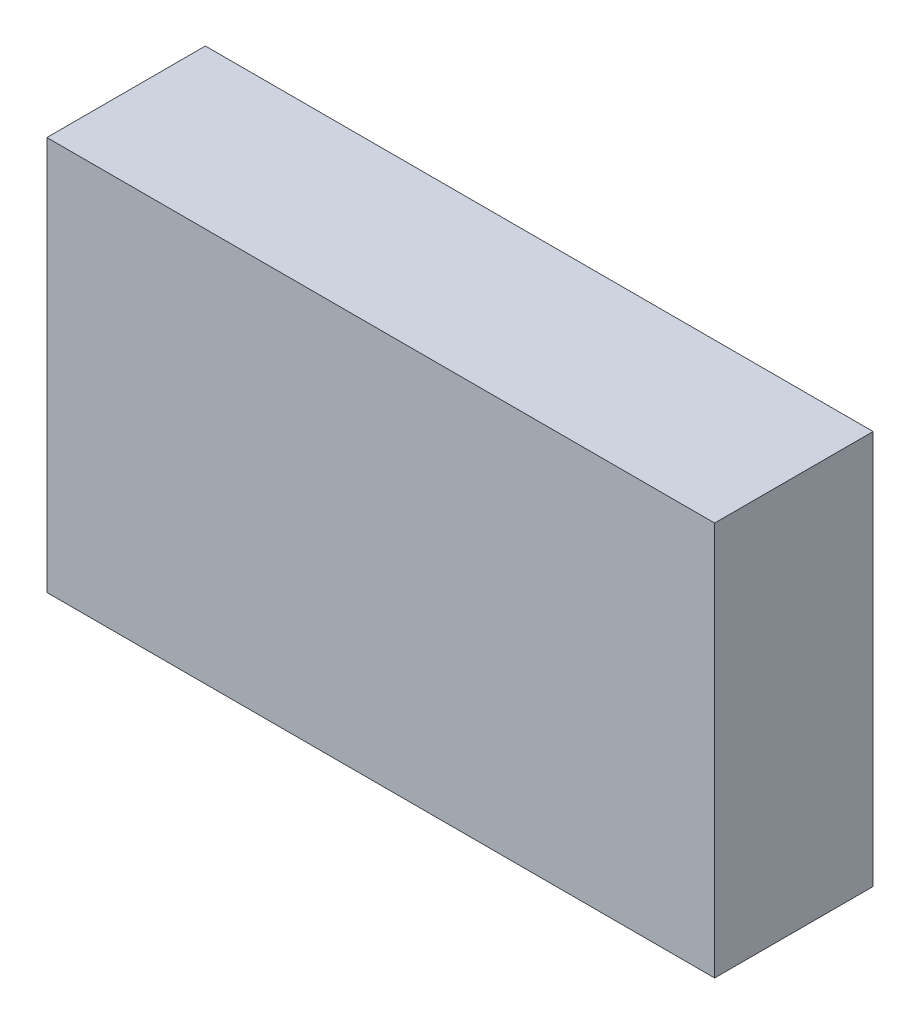
ISO-10303-21;
HEADER;
FILE_DESCRIPTION(('STEP AP214'),'2;1');
FILE_NAME('part.step','',(''),(''),'','','');
FILE_SCHEMA(('AUTOMOTIVE_DESIGN { 1 0 10303 214 1 1 1 1 }'));
ENDSEC;
DATA;
#1=APPLICATION_CONTEXT('core data for automotive mechanical design processes');
#2=APPLICATION_PROTOCOL_DEFINITION('international standard','automotive_design',2000,#1);
#3=PRODUCT_CONTEXT('',#1,'mechanical');
#4=PRODUCT('Part','Part','',(#3));
#5=PRODUCT_RELATED_PRODUCT_CATEGORY('part','',(#4));
#6=PRODUCT_DEFINITION_FORMATION('','',#4);
#7=PRODUCT_DEFINITION_CONTEXT('part definition',#1,'design');
#8=PRODUCT_DEFINITION('design','',#6,#7);
#9=PRODUCT_DEFINITION_SHAPE('','',#8);
#10=(LENGTH_UNIT() NAMED_UNIT(*) SI_UNIT(.MILLI.,.METRE.));
#11=(NAMED_UNIT(*) PLANE_ANGLE_UNIT() SI_UNIT($,.RADIAN.));
#12=(NAMED_UNIT(*) SI_UNIT($,.STERADIAN.) SOLID_ANGLE_UNIT());
#13=UNCERTAINTY_MEASURE_WITH_UNIT(LENGTH_MEASURE(1.E-05),#10,'distance_accuracy_value','');
#14=(GEOMETRIC_REPRESENTATION_CONTEXT(3) GLOBAL_UNCERTAINTY_ASSIGNED_CONTEXT((#13)) GLOBAL_UNIT_ASSIGNED_CONTEXT((#10,
#11,#12)) REPRESENTATION_CONTEXT('',''));
#15=CARTESIAN_POINT('',(0.,0.,0.));
#16=DIRECTION('',(0.,0.,1.));
#17=DIRECTION('',(1.,0.,0.));
#18=AXIS2_PLACEMENT_3D('',#15,#16,#17);
#19=CARTESIAN_POINT('',(-179.489466991129,82.588647155319,69.));
#20=DIRECTION('',(1.,0.,0.));
#21=DIRECTION('',(0.,0.,-1.));
#22=AXIS2_PLACEMENT_3D('',#19,#20,#21);
#23=PLANE('',#22);
#24=DIRECTION('',(0.,-1.,0.));
#25=VECTOR('',#24,1.);
#26=CARTESIAN_POINT('',(-179.489466991129,82.588647155319,0.));
#27=LINE('',#26,#25);
#28=CARTESIAN_POINT('',(-179.489466991129,82.588647155319,0.));
#29=VERTEX_POINT('',#28);
#30=CARTESIAN_POINT('',(-179.489466991129,-88.9464821388515,0.));
#31=VERTEX_POINT('',#30);
#32=EDGE_CURVE('E100',#29,#31,#27,.T.);
#33=ORIENTED_EDGE('',*,*,#32,.T.);
#34=DIRECTION('',(0.,0.,-1.));
#35=VECTOR('',#34,1.);
#36=CARTESIAN_POINT('',(-179.489466991129,-88.9464821388515,69.));
#37=LINE('',#36,#35);
#38=CARTESIAN_POINT('',(-179.489466991129,-88.9464821388515,69.));
#39=VERTEX_POINT('',#38);
#40=EDGE_CURVE('E11',#39,#31,#37,.T.);
#41=ORIENTED_EDGE('',*,*,#40,.F.);
#42=DIRECTION('',(0.,-1.,0.));
#43=VECTOR('',#42,1.);
#44=CARTESIAN_POINT('',(-179.489466991129,82.588647155319,69.));
#45=LINE('',#44,#43);
#46=CARTESIAN_POINT('',(-179.489466991129,82.588647155319,69.));
#47=VERTEX_POINT('',#46);
#48=EDGE_CURVE('E88',#47,#39,#45,.T.);
#49=ORIENTED_EDGE('',*,*,#48,.F.);
#50=DIRECTION('',(0.,0.,-1.));
#51=VECTOR('',#50,1.);
#52=CARTESIAN_POINT('',(-179.489466991129,82.588647155319,69.));
#53=LINE('',#52,#51);
#54=EDGE_CURVE('E96',#47,#29,#53,.T.);
#55=ORIENTED_EDGE('',*,*,#54,.T.);
#56=EDGE_LOOP('',(#33,#41,#49,#55));
#57=FACE_BOUND('',#56,.T.);
#58=ADVANCED_FACE('F37',(#57),#23,.F.);
#59=CARTESIAN_POINT('',(-179.489466991129,-88.9464821388515,69.));
#60=DIRECTION('',(0.,1.,0.));
#61=DIRECTION('',(0.,0.,1.));
#62=AXIS2_PLACEMENT_3D('',#59,#60,#61);
#63=PLANE('',#62);
#64=DIRECTION('',(1.,0.,0.));
#65=VECTOR('',#64,1.);
#66=CARTESIAN_POINT('',(-179.489466991129,-88.9464821388515,0.));
#67=LINE('',#66,#65);
#68=CARTESIAN_POINT('',(111.212532697095,-88.9464821388515,0.));
#69=VERTEX_POINT('',#68);
#70=EDGE_CURVE('E92',#31,#69,#67,.T.);
#71=ORIENTED_EDGE('',*,*,#70,.T.);
#72=DIRECTION('',(0.,0.,-1.));
#73=VECTOR('',#72,1.);
#74=CARTESIAN_POINT('',(111.212532697095,-88.9464821388515,69.));
#75=LINE('',#74,#73);
#76=CARTESIAN_POINT('',(111.212532697095,-88.9464821388515,69.));
#77=VERTEX_POINT('',#76);
#78=EDGE_CURVE('E45',#77,#69,#75,.T.);
#79=ORIENTED_EDGE('',*,*,#78,.F.);
#80=DIRECTION('',(1.,0.,0.));
#81=VECTOR('',#80,1.);
#82=CARTESIAN_POINT('',(-179.489466991129,-88.9464821388515,69.));
#83=LINE('',#82,#81);
#84=EDGE_CURVE('E83',#39,#77,#83,.T.);
#85=ORIENTED_EDGE('',*,*,#84,.F.);
#86=ORIENTED_EDGE('',*,*,#40,.T.);
#87=EDGE_LOOP('',(#71,#79,#85,#86));
#88=FACE_BOUND('',#87,.T.);
#89=ADVANCED_FACE('F91',(#88),#63,.F.);
#90=CARTESIAN_POINT('',(111.212532697095,82.588647155319,69.));
#91=DIRECTION('',(-1.,0.,0.));
#92=DIRECTION('',(0.,0.,1.));
#93=AXIS2_PLACEMENT_3D('',#90,#91,#92);
#94=PLANE('',#93);
#95=DIRECTION('',(0.,1.,0.));
#96=VECTOR('',#95,1.);
#97=CARTESIAN_POINT('',(111.212532697095,82.588647155319,0.));
#98=LINE('',#97,#96);
#99=CARTESIAN_POINT('',(111.212532697095,82.588647155319,0.));
#100=VERTEX_POINT('',#99);
#101=EDGE_CURVE('E70',#69,#100,#98,.T.);
#102=ORIENTED_EDGE('',*,*,#101,.T.);
#103=DIRECTION('',(0.,0.,-1.));
#104=VECTOR('',#103,1.);
#105=CARTESIAN_POINT('',(111.212532697095,82.588647155319,69.));
#106=LINE('',#105,#104);
#107=CARTESIAN_POINT('',(111.212532697095,82.588647155319,69.));
#108=VERTEX_POINT('',#107);
#109=EDGE_CURVE('E93',#108,#100,#106,.T.);
#110=ORIENTED_EDGE('',*,*,#109,.F.);
#111=DIRECTION('',(0.,1.,0.));
#112=VECTOR('',#111,1.);
#113=CARTESIAN_POINT('',(111.212532697095,82.588647155319,69.));
#114=LINE('',#113,#112);
#115=EDGE_CURVE('E86',#77,#108,#114,.T.);
#116=ORIENTED_EDGE('',*,*,#115,.F.);
#117=ORIENTED_EDGE('',*,*,#78,.T.);
#118=EDGE_LOOP('',(#102,#110,#116,#117));
#119=FACE_BOUND('',#118,.T.);
#120=ADVANCED_FACE('F94',(#119),#94,.F.);
#121=CARTESIAN_POINT('',(-179.489466991129,82.588647155319,69.));
#122=DIRECTION('',(0.,-1.,0.));
#123=DIRECTION('',(0.,0.,-1.));
#124=AXIS2_PLACEMENT_3D('',#121,#122,#123);
#125=PLANE('',#124);
#126=DIRECTION('',(-1.,0.,0.));
#127=VECTOR('',#126,1.);
#128=CARTESIAN_POINT('',(-179.489466991129,82.588647155319,0.));
#129=LINE('',#128,#127);
#130=EDGE_CURVE('E76',#100,#29,#129,.T.);
#131=ORIENTED_EDGE('',*,*,#130,.T.);
#132=ORIENTED_EDGE('',*,*,#54,.F.);
#133=DIRECTION('',(-1.,0.,0.));
#134=VECTOR('',#133,1.);
#135=CARTESIAN_POINT('',(-179.489466991129,82.588647155319,69.));
#136=LINE('',#135,#134);
#137=EDGE_CURVE('E53',#108,#47,#136,.T.);
#138=ORIENTED_EDGE('',*,*,#137,.F.);
#139=ORIENTED_EDGE('',*,*,#109,.T.);
#140=EDGE_LOOP('',(#131,#132,#138,#139));
#141=FACE_BOUND('',#140,.T.);
#142=ADVANCED_FACE('F107',(#141),#125,.F.);
#143=CARTESIAN_POINT('',(0.,0.,69.));
#144=DIRECTION('',(0.,0.,1.));
#145=DIRECTION('',(1.,0.,0.));
#146=AXIS2_PLACEMENT_3D('',#143,#144,#145);
#147=PLANE('',#146);
#148=ORIENTED_EDGE('',*,*,#48,.T.);
#149=ORIENTED_EDGE('',*,*,#84,.T.);
#150=ORIENTED_EDGE('',*,*,#115,.T.);
#151=ORIENTED_EDGE('',*,*,#137,.T.);
#152=EDGE_LOOP('',(#148,#149,#150,#151));
#153=FACE_BOUND('',#152,.T.);
#154=ADVANCED_FACE('F84',(#153),#147,.T.);
#155=CARTESIAN_POINT('',(0.,0.,0.));
#156=DIRECTION('',(0.,0.,1.));
#157=DIRECTION('',(1.,0.,0.));
#158=AXIS2_PLACEMENT_3D('',#155,#156,#157);
#159=PLANE('',#158);
#160=ORIENTED_EDGE('',*,*,#32,.F.);
#161=ORIENTED_EDGE('',*,*,#130,.F.);
#162=ORIENTED_EDGE('',*,*,#101,.F.);
#163=ORIENTED_EDGE('',*,*,#70,.F.);
#164=EDGE_LOOP('',(#160,#161,#162,#163));
#165=FACE_BOUND('',#164,.T.);
#166=ADVANCED_FACE('F110',(#165),#159,.F.);
#167=CLOSED_SHELL('',(#58,#89,#120,#142,#154,#166));
#168=MANIFOLD_SOLID_BREP('B2',#167);
#169=ADVANCED_BREP_SHAPE_REPRESENTATION('',(#18,#168),#14);
#170=SHAPE_DEFINITION_REPRESENTATION(#9,#169);
ENDSEC;
END-ISO-10303-21;
